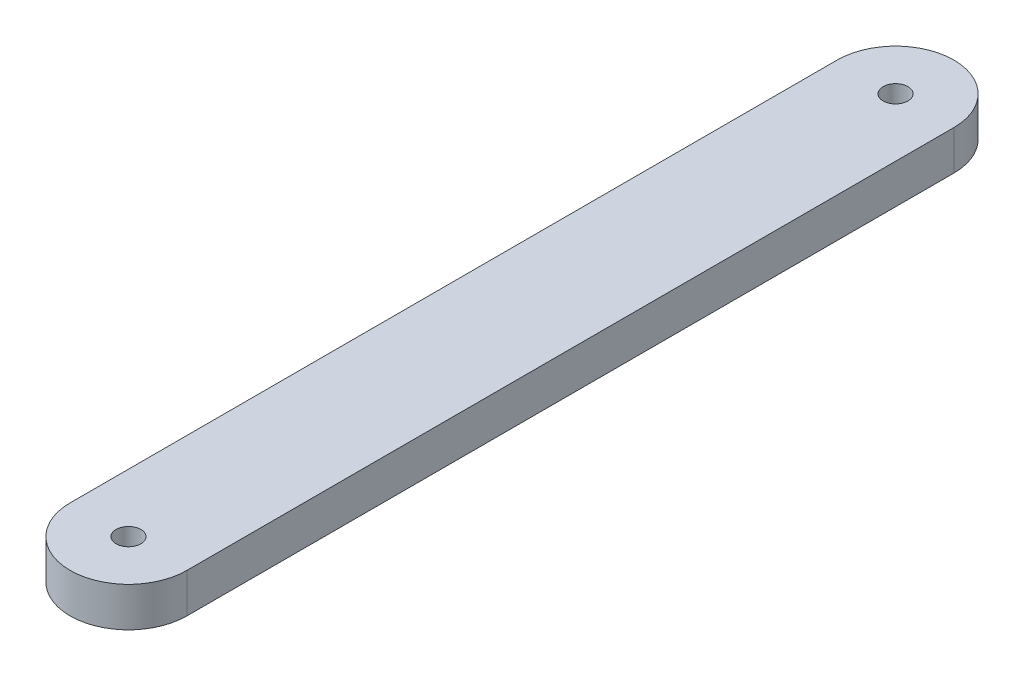
ISO-10303-21;
HEADER;
FILE_DESCRIPTION(('STEP AP214'),'2;1');
FILE_NAME('part.step','',(''),(''),'','','');
FILE_SCHEMA(('AUTOMOTIVE_DESIGN { 1 0 10303 214 1 1 1 1 }'));
ENDSEC;
DATA;
#1=APPLICATION_CONTEXT('core data for automotive mechanical design processes');
#2=APPLICATION_PROTOCOL_DEFINITION('international standard','automotive_design',2000,#1);
#3=PRODUCT_CONTEXT('',#1,'mechanical');
#4=PRODUCT('Part','Part','',(#3));
#5=PRODUCT_RELATED_PRODUCT_CATEGORY('part','',(#4));
#6=PRODUCT_DEFINITION_FORMATION('','',#4);
#7=PRODUCT_DEFINITION_CONTEXT('part definition',#1,'design');
#8=PRODUCT_DEFINITION('design','',#6,#7);
#9=PRODUCT_DEFINITION_SHAPE('','',#8);
#10=(LENGTH_UNIT() NAMED_UNIT(*) SI_UNIT(.MILLI.,.METRE.));
#11=(NAMED_UNIT(*) PLANE_ANGLE_UNIT() SI_UNIT($,.RADIAN.));
#12=(NAMED_UNIT(*) SI_UNIT($,.STERADIAN.) SOLID_ANGLE_UNIT());
#13=UNCERTAINTY_MEASURE_WITH_UNIT(LENGTH_MEASURE(1.E-05),#10,'distance_accuracy_value','');
#14=(GEOMETRIC_REPRESENTATION_CONTEXT(3) GLOBAL_UNCERTAINTY_ASSIGNED_CONTEXT((#13)) GLOBAL_UNIT_ASSIGNED_CONTEXT((#10,
#11,#12)) REPRESENTATION_CONTEXT('',''));
#15=CARTESIAN_POINT('',(0.,0.,0.));
#16=DIRECTION('',(0.,0.,1.));
#17=DIRECTION('',(1.,0.,0.));
#18=AXIS2_PLACEMENT_3D('',#15,#16,#17);
#19=CARTESIAN_POINT('',(0.,6.35,61.722));
#20=DIRECTION('',(0.,-1.,0.));
#21=DIRECTION('',(0.,0.,-1.));
#22=AXIS2_PLACEMENT_3D('',#19,#20,#21);
#23=CYLINDRICAL_SURFACE('',#22,9.40323098503559);
#24=CARTESIAN_POINT('',(0.,0.,61.722));
#25=DIRECTION('',(0.,1.,0.));
#26=DIRECTION('',(0.,0.,1.));
#27=AXIS2_PLACEMENT_3D('',#24,#25,#26);
#28=CIRCLE('',#27,9.40323098503559);
#29=CARTESIAN_POINT('',(-9.40323098503559,0.,61.722));
#30=VERTEX_POINT('',#29);
#31=CARTESIAN_POINT('',(9.40323098503559,0.,61.722));
#32=VERTEX_POINT('',#31);
#33=EDGE_CURVE('E95',#30,#32,#28,.T.);
#34=ORIENTED_EDGE('',*,*,#33,.T.);
#35=DIRECTION('',(0.,-1.,0.));
#36=VECTOR('',#35,1.);
#37=CARTESIAN_POINT('',(9.40323098503559,6.35,61.722));
#38=LINE('',#37,#36);
#39=CARTESIAN_POINT('',(9.40323098503559,6.35,61.722));
#40=VERTEX_POINT('',#39);
#41=EDGE_CURVE('E11',#40,#32,#38,.T.);
#42=ORIENTED_EDGE('',*,*,#41,.F.);
#43=CARTESIAN_POINT('',(0.,6.35,61.722));
#44=DIRECTION('',(0.,1.,0.));
#45=DIRECTION('',(0.,0.,1.));
#46=AXIS2_PLACEMENT_3D('',#43,#44,#45);
#47=CIRCLE('',#46,9.40323098503559);
#48=CARTESIAN_POINT('',(-9.40323098503559,6.35,61.722));
#49=VERTEX_POINT('',#48);
#50=EDGE_CURVE('E83',#49,#40,#47,.T.);
#51=ORIENTED_EDGE('',*,*,#50,.F.);
#52=DIRECTION('',(0.,-1.,0.));
#53=VECTOR('',#52,1.);
#54=CARTESIAN_POINT('',(-9.40323098503559,6.35,61.722));
#55=LINE('',#54,#53);
#56=EDGE_CURVE('E91',#49,#30,#55,.T.);
#57=ORIENTED_EDGE('',*,*,#56,.T.);
#58=EDGE_LOOP('',(#34,#42,#51,#57));
#59=FACE_BOUND('',#58,.T.);
#60=ADVANCED_FACE('F32',(#59),#23,.T.);
#61=CARTESIAN_POINT('',(9.40323098503559,6.35,61.722));
#62=DIRECTION('',(-1.,0.,0.));
#63=DIRECTION('',(0.,0.,1.));
#64=AXIS2_PLACEMENT_3D('',#61,#62,#63);
#65=PLANE('',#64);
#66=DIRECTION('',(0.,0.,-1.));
#67=VECTOR('',#66,1.);
#68=CARTESIAN_POINT('',(9.40323098503559,0.,61.722));
#69=LINE('',#68,#67);
#70=CARTESIAN_POINT('',(9.40323098503559,0.,-61.722));
#71=VERTEX_POINT('',#70);
#72=EDGE_CURVE('E87',#32,#71,#69,.T.);
#73=ORIENTED_EDGE('',*,*,#72,.T.);
#74=DIRECTION('',(0.,-1.,0.));
#75=VECTOR('',#74,1.);
#76=CARTESIAN_POINT('',(9.40323098503559,6.35,-61.722));
#77=LINE('',#76,#75);
#78=CARTESIAN_POINT('',(9.40323098503559,6.35,-61.722));
#79=VERTEX_POINT('',#78);
#80=EDGE_CURVE('E40',#79,#71,#77,.T.);
#81=ORIENTED_EDGE('',*,*,#80,.F.);
#82=DIRECTION('',(0.,0.,-1.));
#83=VECTOR('',#82,1.);
#84=CARTESIAN_POINT('',(9.40323098503559,6.35,61.722));
#85=LINE('',#84,#83);
#86=EDGE_CURVE('E78',#40,#79,#85,.T.);
#87=ORIENTED_EDGE('',*,*,#86,.F.);
#88=ORIENTED_EDGE('',*,*,#41,.T.);
#89=EDGE_LOOP('',(#73,#81,#87,#88));
#90=FACE_BOUND('',#89,.T.);
#91=ADVANCED_FACE('F86',(#90),#65,.F.);
#92=CARTESIAN_POINT('',(0.,6.35,-61.722));
#93=DIRECTION('',(0.,-1.,0.));
#94=DIRECTION('',(0.,0.,-1.));
#95=AXIS2_PLACEMENT_3D('',#92,#93,#94);
#96=CYLINDRICAL_SURFACE('',#95,9.40323098503559);
#97=CARTESIAN_POINT('',(0.,0.,-61.722));
#98=DIRECTION('',(0.,1.,0.));
#99=DIRECTION('',(0.,0.,1.));
#100=AXIS2_PLACEMENT_3D('',#97,#98,#99);
#101=CIRCLE('',#100,9.40323098503559);
#102=CARTESIAN_POINT('',(-9.40323098503562,0.,-61.722));
#103=VERTEX_POINT('',#102);
#104=EDGE_CURVE('E65',#71,#103,#101,.T.);
#105=ORIENTED_EDGE('',*,*,#104,.T.);
#106=DIRECTION('',(0.,-1.,0.));
#107=VECTOR('',#106,1.);
#108=CARTESIAN_POINT('',(-9.40323098503562,6.35,-61.722));
#109=LINE('',#108,#107);
#110=CARTESIAN_POINT('',(-9.40323098503562,6.35,-61.722));
#111=VERTEX_POINT('',#110);
#112=EDGE_CURVE('E88',#111,#103,#109,.T.);
#113=ORIENTED_EDGE('',*,*,#112,.F.);
#114=CARTESIAN_POINT('',(0.,6.35,-61.722));
#115=DIRECTION('',(0.,1.,0.));
#116=DIRECTION('',(0.,0.,1.));
#117=AXIS2_PLACEMENT_3D('',#114,#115,#116);
#118=CIRCLE('',#117,9.40323098503559);
#119=EDGE_CURVE('E81',#79,#111,#118,.T.);
#120=ORIENTED_EDGE('',*,*,#119,.F.);
#121=ORIENTED_EDGE('',*,*,#80,.T.);
#122=EDGE_LOOP('',(#105,#113,#120,#121));
#123=FACE_BOUND('',#122,.T.);
#124=ADVANCED_FACE('F89',(#123),#96,.T.);
#125=CARTESIAN_POINT('',(-9.40323098503559,6.35,61.722));
#126=DIRECTION('',(1.,0.,0.));
#127=DIRECTION('',(0.,0.,-1.));
#128=AXIS2_PLACEMENT_3D('',#125,#126,#127);
#129=PLANE('',#128);
#130=DIRECTION('',(0.,0.,1.));
#131=VECTOR('',#130,1.);
#132=CARTESIAN_POINT('',(-9.40323098503559,0.,61.722));
#133=LINE('',#132,#131);
#134=EDGE_CURVE('E71',#103,#30,#133,.T.);
#135=ORIENTED_EDGE('',*,*,#134,.T.);
#136=ORIENTED_EDGE('',*,*,#56,.F.);
#137=DIRECTION('',(0.,0.,1.));
#138=VECTOR('',#137,1.);
#139=CARTESIAN_POINT('',(-9.40323098503559,6.35,61.722));
#140=LINE('',#139,#138);
#141=EDGE_CURVE('E48',#111,#49,#140,.T.);
#142=ORIENTED_EDGE('',*,*,#141,.F.);
#143=ORIENTED_EDGE('',*,*,#112,.T.);
#144=EDGE_LOOP('',(#135,#136,#142,#143));
#145=FACE_BOUND('',#144,.T.);
#146=ADVANCED_FACE('F103',(#145),#129,.F.);
#147=CARTESIAN_POINT('',(0.,6.35,61.722));
#148=DIRECTION('',(0.,1.,0.));
#149=DIRECTION('',(0.,0.,1.));
#150=AXIS2_PLACEMENT_3D('',#147,#148,#149);
#151=PLANE('',#150);
#152=CARTESIAN_POINT('',(0.,6.35,61.722));
#153=DIRECTION('',(0.,1.,0.));
#154=DIRECTION('',(0.,0.,1.));
#155=AXIS2_PLACEMENT_3D('',#152,#153,#154);
#156=CIRCLE('',#155,2.);
#157=CARTESIAN_POINT('',(0.,6.35,63.722));
#158=VERTEX_POINT('',#157);
#159=EDGE_CURVE('E117',#158,#158,#156,.T.);
#160=ORIENTED_EDGE('',*,*,#159,.F.);
#161=EDGE_LOOP('',(#160));
#162=FACE_BOUND('',#161,.T.);
#163=CARTESIAN_POINT('',(0.,6.35,-61.722));
#164=DIRECTION('',(0.,1.,0.));
#165=DIRECTION('',(0.,0.,1.));
#166=AXIS2_PLACEMENT_3D('',#163,#164,#165);
#167=CIRCLE('',#166,2.);
#168=CARTESIAN_POINT('',(0.,6.35,-59.722));
#169=VERTEX_POINT('',#168);
#170=EDGE_CURVE('E111',#169,#169,#167,.T.);
#171=ORIENTED_EDGE('',*,*,#170,.F.);
#172=EDGE_LOOP('',(#171));
#173=FACE_BOUND('',#172,.T.);
#174=ORIENTED_EDGE('',*,*,#50,.T.);
#175=ORIENTED_EDGE('',*,*,#86,.T.);
#176=ORIENTED_EDGE('',*,*,#119,.T.);
#177=ORIENTED_EDGE('',*,*,#141,.T.);
#178=EDGE_LOOP('',(#174,#175,#176,#177));
#179=FACE_BOUND('',#178,.T.);
#180=ADVANCED_FACE('F79',(#162,#173,#179),#151,.T.);
#181=CARTESIAN_POINT('',(0.,0.,61.722));
#182=DIRECTION('',(0.,1.,0.));
#183=DIRECTION('',(0.,0.,1.));
#184=AXIS2_PLACEMENT_3D('',#181,#182,#183);
#185=PLANE('',#184);
#186=CARTESIAN_POINT('',(0.,0.,61.722));
#187=DIRECTION('',(0.,1.,0.));
#188=DIRECTION('',(0.,0.,1.));
#189=AXIS2_PLACEMENT_3D('',#186,#187,#188);
#190=CIRCLE('',#189,2.);
#191=CARTESIAN_POINT('',(0.,0.,63.722));
#192=VERTEX_POINT('',#191);
#193=EDGE_CURVE('E114',#192,#192,#190,.T.);
#194=ORIENTED_EDGE('',*,*,#193,.T.);
#195=EDGE_LOOP('',(#194));
#196=FACE_BOUND('',#195,.T.);
#197=CARTESIAN_POINT('',(0.,0.,-61.722));
#198=DIRECTION('',(0.,1.,0.));
#199=DIRECTION('',(0.,0.,1.));
#200=AXIS2_PLACEMENT_3D('',#197,#198,#199);
#201=CIRCLE('',#200,2.);
#202=CARTESIAN_POINT('',(0.,0.,-59.722));
#203=VERTEX_POINT('',#202);
#204=EDGE_CURVE('E98',#203,#203,#201,.T.);
#205=ORIENTED_EDGE('',*,*,#204,.T.);
#206=EDGE_LOOP('',(#205));
#207=FACE_BOUND('',#206,.T.);
#208=ORIENTED_EDGE('',*,*,#33,.F.);
#209=ORIENTED_EDGE('',*,*,#134,.F.);
#210=ORIENTED_EDGE('',*,*,#104,.F.);
#211=ORIENTED_EDGE('',*,*,#72,.F.);
#212=EDGE_LOOP('',(#208,#209,#210,#211));
#213=FACE_BOUND('',#212,.T.);
#214=ADVANCED_FACE('F106',(#196,#207,#213),#185,.F.);
#215=CARTESIAN_POINT('',(0.,6.35,-61.722));
#216=DIRECTION('',(0.,1.,0.));
#217=DIRECTION('',(0.,0.,1.));
#218=AXIS2_PLACEMENT_3D('',#215,#216,#217);
#219=CYLINDRICAL_SURFACE('',#218,2.);
#220=ORIENTED_EDGE('',*,*,#204,.F.);
#221=EDGE_LOOP('',(#220));
#222=FACE_BOUND('',#221,.T.);
#223=ORIENTED_EDGE('',*,*,#170,.T.);
#224=EDGE_LOOP('',(#223));
#225=FACE_BOUND('',#224,.T.);
#226=ADVANCED_FACE('F128',(#222,#225),#219,.F.);
#227=CARTESIAN_POINT('',(0.,6.35,61.722));
#228=DIRECTION('',(0.,1.,0.));
#229=DIRECTION('',(0.,0.,1.));
#230=AXIS2_PLACEMENT_3D('',#227,#228,#229);
#231=CYLINDRICAL_SURFACE('',#230,2.);
#232=ORIENTED_EDGE('',*,*,#193,.F.);
#233=EDGE_LOOP('',(#232));
#234=FACE_BOUND('',#233,.T.);
#235=ORIENTED_EDGE('',*,*,#159,.T.);
#236=EDGE_LOOP('',(#235));
#237=FACE_BOUND('',#236,.T.);
#238=ADVANCED_FACE('F121',(#234,#237),#231,.F.);
#239=CLOSED_SHELL('',(#60,#91,#124,#146,#180,#214,#226,#238));
#240=MANIFOLD_SOLID_BREP('B2',#239);
#241=ADVANCED_BREP_SHAPE_REPRESENTATION('',(#18,#240),#14);
#242=SHAPE_DEFINITION_REPRESENTATION(#9,#241);
ENDSEC;
END-ISO-10303-21;
